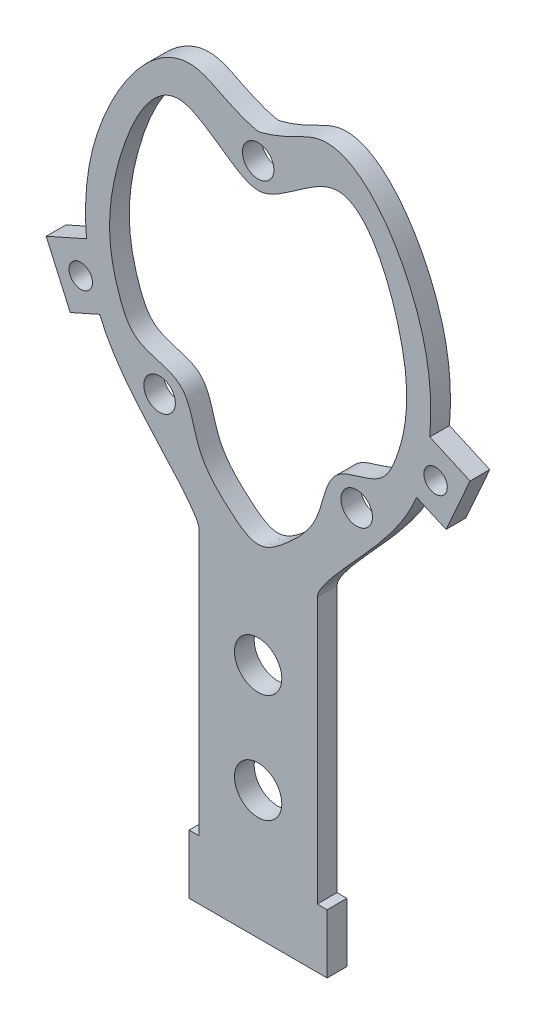
ISO-10303-21;
HEADER;
FILE_DESCRIPTION(('STEP AP214'),'2;1');
FILE_NAME('part.step','',(''),(''),'','','');
FILE_SCHEMA(('AUTOMOTIVE_DESIGN { 1 0 10303 214 1 1 1 1 }'));
ENDSEC;
DATA;
#1=APPLICATION_CONTEXT('core data for automotive mechanical design processes');
#2=APPLICATION_PROTOCOL_DEFINITION('international standard','automotive_design',2000,#1);
#3=PRODUCT_CONTEXT('',#1,'mechanical');
#4=PRODUCT('Part','Part','',(#3));
#5=PRODUCT_RELATED_PRODUCT_CATEGORY('part','',(#4));
#6=PRODUCT_DEFINITION_FORMATION('','',#4);
#7=PRODUCT_DEFINITION_CONTEXT('part definition',#1,'design');
#8=PRODUCT_DEFINITION('design','',#6,#7);
#9=PRODUCT_DEFINITION_SHAPE('','',#8);
#10=(LENGTH_UNIT() NAMED_UNIT(*) SI_UNIT(.MILLI.,.METRE.));
#11=(NAMED_UNIT(*) PLANE_ANGLE_UNIT() SI_UNIT($,.RADIAN.));
#12=(NAMED_UNIT(*) SI_UNIT($,.STERADIAN.) SOLID_ANGLE_UNIT());
#13=UNCERTAINTY_MEASURE_WITH_UNIT(LENGTH_MEASURE(1.E-05),#10,'distance_accuracy_value','');
#14=(GEOMETRIC_REPRESENTATION_CONTEXT(3) GLOBAL_UNCERTAINTY_ASSIGNED_CONTEXT((#13)) GLOBAL_UNIT_ASSIGNED_CONTEXT((#10,
#11,#12)) REPRESENTATION_CONTEXT('',''));
#15=CARTESIAN_POINT('',(0.,0.,0.));
#16=DIRECTION('',(0.,0.,1.));
#17=DIRECTION('',(1.,0.,0.));
#18=AXIS2_PLACEMENT_3D('',#15,#16,#17);
#19=CARTESIAN_POINT('',(3.,-12.1,1.));
#20=CARTESIAN_POINT('',(3.05810382849844,-11.4358702012722,1.));
#21=CARTESIAN_POINT('',(7.37215641866731,-7.261735624356,1.));
#22=CARTESIAN_POINT('',(8.81630154843033,-3.81963664134236,1.));
#23=CARTESIAN_POINT('',(8.79521131462367,3.08822074814355,1.));
#24=CARTESIAN_POINT('',(4.729906030544,9.50271441729498,1.));
#25=CARTESIAN_POINT('',(1.543138013164,7.28524745478808,1.));
#26=CARTESIAN_POINT('',(0.138381746873036,6.84873014882035,1.));
#27=CARTESIAN_POINT('',(-0.138381746873038,6.84873014882035,1.));
#28=CARTESIAN_POINT('',(-1.54313801316398,7.28524745478807,1.));
#29=CARTESIAN_POINT('',(-4.72990603054404,9.50271441729499,1.));
#30=CARTESIAN_POINT('',(-8.79521131462372,3.0882207481436,1.));
#31=CARTESIAN_POINT('',(-8.8163015484302,-3.81963664134249,1.));
#32=CARTESIAN_POINT('',(-7.37215641866838,-7.26173562435472,1.));
#33=CARTESIAN_POINT('',(-3.05810382849843,-11.4358702012722,1.));
#34=CARTESIAN_POINT('',(-3.,-12.1,1.));
#35=B_SPLINE_CURVE_WITH_KNOTS('',3,(#19,#20,#21,#22,#23,#24,#25,#26,#27,#28,#29,#30,#31,#32,#33,
#34),.UNSPECIFIED.,.F.,.F.,(4,1,1,1,1,1,1,1,1,1,1,1,1,4),(0.110531839016768,0.195870509209985,
0.310871914861414,0.375079995003274,0.502014152037678,0.537662277859493,0.553505555343509,
0.55702628367329,0.572869561157307,0.608517686979122,0.735451844013526,0.799659924155386,
0.914661329806814,1.),.UNSPECIFIED.);
#36=DIRECTION('',(0.,0.,-1.));
#37=VECTOR('',#36,1.);
#38=SURFACE_OF_LINEAR_EXTRUSION('',#35,#37);
#39=DIRECTION('',(0.,0.,-1.));
#40=VECTOR('',#39,1.);
#41=CARTESIAN_POINT('',(8.03882350949442,-5.2140110725418,1.));
#42=LINE('',#41,#40);
#43=CARTESIAN_POINT('',(8.03882351508526,-5.2140110590012,1.));
#44=VERTEX_POINT('',#43);
#45=CARTESIAN_POINT('',(8.03882351508526,-5.2140110590012,0.));
#46=VERTEX_POINT('',#45);
#47=EDGE_CURVE('E59',#44,#46,#42,.T.);
#48=ORIENTED_EDGE('',*,*,#47,.F.);
#49=CARTESIAN_POINT('',(3.,-12.1,1.));
#50=VERTEX_POINT('',#49);
#51=EDGE_CURVE('E158',#50,#44,#35,.T.);
#52=ORIENTED_EDGE('',*,*,#51,.F.);
#53=DIRECTION('',(0.,0.,-1.));
#54=VECTOR('',#53,1.);
#55=CARTESIAN_POINT('',(3.,-12.1,1.));
#56=LINE('',#55,#54);
#57=CARTESIAN_POINT('',(3.,-12.1,0.));
#58=VERTEX_POINT('',#57);
#59=EDGE_CURVE('E600',#50,#58,#56,.T.);
#60=ORIENTED_EDGE('',*,*,#59,.T.);
#61=CARTESIAN_POINT('',(3.,-12.1,0.));
#62=CARTESIAN_POINT('',(3.05810382849844,-11.4358702012722,0.));
#63=CARTESIAN_POINT('',(7.37215641866731,-7.261735624356,0.));
#64=CARTESIAN_POINT('',(8.81630154843033,-3.81963664134236,0.));
#65=CARTESIAN_POINT('',(8.79521131462367,3.08822074814355,0.));
#66=CARTESIAN_POINT('',(4.729906030544,9.50271441729498,0.));
#67=CARTESIAN_POINT('',(1.543138013164,7.28524745478808,0.));
#68=CARTESIAN_POINT('',(0.138381746873036,6.84873014882035,0.));
#69=CARTESIAN_POINT('',(-0.138381746873038,6.84873014882035,0.));
#70=CARTESIAN_POINT('',(-1.54313801316398,7.28524745478807,0.));
#71=CARTESIAN_POINT('',(-4.72990603054404,9.50271441729499,0.));
#72=CARTESIAN_POINT('',(-8.79521131462372,3.0882207481436,0.));
#73=CARTESIAN_POINT('',(-8.8163015484302,-3.81963664134249,0.));
#74=CARTESIAN_POINT('',(-7.37215641866838,-7.26173562435472,0.));
#75=CARTESIAN_POINT('',(-3.05810382849843,-11.4358702012722,0.));
#76=CARTESIAN_POINT('',(-3.,-12.1,0.));
#77=B_SPLINE_CURVE_WITH_KNOTS('',3,(#61,#62,#63,#64,#65,#66,#67,#68,#69,#70,#71,#72,#73,#74,#75,
#76),.UNSPECIFIED.,.F.,.F.,(4,1,1,1,1,1,1,1,1,1,1,1,1,4),(0.110531839016768,0.195870509209985,
0.310871914861414,0.375079995003274,0.502014152037678,0.537662277859493,0.553505555343509,
0.55702628367329,0.572869561157307,0.608517686979122,0.735451844013526,0.799659924155386,
0.914661329806814,1.),.UNSPECIFIED.);
#78=EDGE_CURVE('E601',#58,#46,#77,.T.);
#79=ORIENTED_EDGE('',*,*,#78,.T.);
#80=EDGE_LOOP('',(#48,#52,#60,#79));
#81=FACE_BOUND('',#80,.T.);
#82=ADVANCED_FACE('F35',(#81),#38,.F.);
#83=CARTESIAN_POINT('',(8.70653859742456,-2.22738816520244,1.));
#84=VERTEX_POINT('',#83);
#85=CARTESIAN_POINT('',(-8.70653859742455,-2.22738816520243,1.));
#86=VERTEX_POINT('',#85);
#87=EDGE_CURVE('E51',#84,#86,#35,.T.);
#88=ORIENTED_EDGE('',*,*,#87,.F.);
#89=DIRECTION('',(0.,0.,-1.));
#90=VECTOR('',#89,1.);
#91=CARTESIAN_POINT('',(8.70653859884647,-2.22738814841654,1.));
#92=LINE('',#91,#90);
#93=CARTESIAN_POINT('',(8.70653860389698,-2.22738815066517,0.));
#94=VERTEX_POINT('',#93);
#95=EDGE_CURVE('E186',#84,#94,#92,.T.);
#96=ORIENTED_EDGE('',*,*,#95,.T.);
#97=CARTESIAN_POINT('',(-8.70653859742455,-2.22738816520243,0.));
#98=VERTEX_POINT('',#97);
#99=EDGE_CURVE('E565',#94,#98,#77,.T.);
#100=ORIENTED_EDGE('',*,*,#99,.T.);
#101=DIRECTION('',(0.,0.,-1.));
#102=VECTOR('',#101,1.);
#103=CARTESIAN_POINT('',(-8.70653859884646,-2.22738814841654,1.));
#104=LINE('',#103,#102);
#105=EDGE_CURVE('E44',#86,#98,#104,.T.);
#106=ORIENTED_EDGE('',*,*,#105,.F.);
#107=EDGE_LOOP('',(#88,#96,#100,#106));
#108=FACE_BOUND('',#107,.T.);
#109=ADVANCED_FACE('F263',(#108),#38,.F.);
#110=CARTESIAN_POINT('',(4.5364712962688E-13,6.85,1.));
#111=DIRECTION('',(0.,0.,1.));
#112=DIRECTION('',(1.,0.,0.));
#113=AXIS2_PLACEMENT_3D('',#110,#111,#112);
#114=PLANE('',#113);
#115=CARTESIAN_POINT('',(-8.99999999638667,-4.00000000811566,0.999999999999999));
#116=DIRECTION('',(0.,0.,1.));
#117=DIRECTION('',(1.,0.,0.));
#118=AXIS2_PLACEMENT_3D('',#115,#116,#117);
#119=CIRCLE('',#118,0.59499999891735);
#120=CARTESIAN_POINT('',(-8.40499999746932,-4.00000000811566,0.999999999999999));
#121=VERTEX_POINT('',#120);
#122=EDGE_CURVE('E181',#121,#121,#119,.F.);
#123=ORIENTED_EDGE('',*,*,#122,.T.);
#124=EDGE_LOOP('',(#123));
#125=FACE_BOUND('',#124,.T.);
#126=CARTESIAN_POINT('',(8.99999999638667,-4.00000000811566,0.999999999999999));
#127=DIRECTION('',(0.,0.,1.));
#128=DIRECTION('',(1.,0.,0.));
#129=AXIS2_PLACEMENT_3D('',#126,#127,#128);
#130=CIRCLE('',#129,0.594999998917349);
#131=CARTESIAN_POINT('',(9.59499999530402,-4.00000000811566,0.999999999999999));
#132=VERTEX_POINT('',#131);
#133=EDGE_CURVE('E552',#132,#132,#130,.F.);
#134=ORIENTED_EDGE('',*,*,#133,.T.);
#135=EDGE_LOOP('',(#134));
#136=FACE_BOUND('',#135,.T.);
#137=ORIENTED_EDGE('',*,*,#51,.T.);
#138=DIRECTION('',(0.9135454576426,-0.406736643075802,0.));
#139=VECTOR('',#138,1.);
#140=CARTESIAN_POINT('',(-0.607482344183345,-1.36442768453332,1.));
#141=LINE('',#140,#139);
#142=CARTESIAN_POINT('',(9.53182685743955,-5.87873899030865,1.));
#143=VERTEX_POINT('',#142);
#144=EDGE_CURVE('E151',#44,#143,#141,.T.);
#145=ORIENTED_EDGE('',*,*,#144,.T.);
#146=DIRECTION('',(-0.406736643075801,-0.913545457642601,0.));
#147=VECTOR('',#146,1.);
#148=CARTESIAN_POINT('',(10.1393092016229,-4.51431130577532,1.));
#149=LINE('',#148,#147);
#150=CARTESIAN_POINT('',(10.752036786667,-3.13810261738085,1.));
#151=VERTEX_POINT('',#150);
#152=EDGE_CURVE('E157',#151,#143,#149,.T.);
#153=ORIENTED_EDGE('',*,*,#152,.F.);
#154=DIRECTION('',(0.913545457642601,-0.406736643075801,0.));
#155=VECTOR('',#154,1.);
#156=CARTESIAN_POINT('',(0.612727585044053,1.37620868839447,1.));
#157=LINE('',#156,#155);
#158=EDGE_CURVE('E160',#84,#151,#157,.T.);
#159=ORIENTED_EDGE('',*,*,#158,.F.);
#160=ORIENTED_EDGE('',*,*,#87,.T.);
#161=DIRECTION('',(-0.913545457642601,-0.406736643075801,0.));
#162=VECTOR('',#161,1.);
#163=CARTESIAN_POINT('',(-0.612727585044054,1.37620868839447,1.));
#164=LINE('',#163,#162);
#165=CARTESIAN_POINT('',(-10.752036786667,-3.13810261738085,1.));
#166=VERTEX_POINT('',#165);
#167=EDGE_CURVE('E191',#86,#166,#164,.T.);
#168=ORIENTED_EDGE('',*,*,#167,.T.);
#169=DIRECTION('',(0.406736643075801,-0.913545457642601,0.));
#170=VECTOR('',#169,1.);
#171=CARTESIAN_POINT('',(-10.1393092016229,-4.51431130577532,1.));
#172=LINE('',#171,#170);
#173=CARTESIAN_POINT('',(-9.53182685743955,-5.87873899030865,1.));
#174=VERTEX_POINT('',#173);
#175=EDGE_CURVE('E194',#166,#174,#172,.T.);
#176=ORIENTED_EDGE('',*,*,#175,.T.);
#177=DIRECTION('',(-0.9135454576426,-0.406736643075802,0.));
#178=VECTOR('',#177,1.);
#179=CARTESIAN_POINT('',(0.607482344183347,-1.36442768453333,1.));
#180=LINE('',#179,#178);
#181=CARTESIAN_POINT('',(-8.03882351508522,-5.21401105900165,1.));
#182=VERTEX_POINT('',#181);
#183=EDGE_CURVE('E189',#182,#174,#180,.T.);
#184=ORIENTED_EDGE('',*,*,#183,.F.);
#185=CARTESIAN_POINT('',(-3.,-12.1,1.));
#186=VERTEX_POINT('',#185);
#187=EDGE_CURVE('E563',#182,#186,#35,.T.);
#188=ORIENTED_EDGE('',*,*,#187,.T.);
#189=DIRECTION('',(0.,-1.,0.));
#190=VECTOR('',#189,1.);
#191=CARTESIAN_POINT('',(-3.,-12.1,1.));
#192=LINE('',#191,#190);
#193=CARTESIAN_POINT('',(-3.,-25.6,1.));
#194=VERTEX_POINT('',#193);
#195=EDGE_CURVE('E585',#186,#194,#192,.T.);
#196=ORIENTED_EDGE('',*,*,#195,.T.);
#197=DIRECTION('',(-1.,0.,0.));
#198=VECTOR('',#197,1.);
#199=CARTESIAN_POINT('',(-3.,-25.6,1.));
#200=LINE('',#199,#198);
#201=CARTESIAN_POINT('',(-3.50000000000003,-25.6,1.));
#202=VERTEX_POINT('',#201);
#203=EDGE_CURVE('E586',#194,#202,#200,.T.);
#204=ORIENTED_EDGE('',*,*,#203,.T.);
#205=DIRECTION('',(0.,-1.,0.));
#206=VECTOR('',#205,1.);
#207=CARTESIAN_POINT('',(-3.50000000000003,-25.6,1.));
#208=LINE('',#207,#206);
#209=CARTESIAN_POINT('',(-3.49999999999999,-28.6,1.));
#210=VERTEX_POINT('',#209);
#211=EDGE_CURVE('E588',#202,#210,#208,.T.);
#212=ORIENTED_EDGE('',*,*,#211,.T.);
#213=DIRECTION('',(1.,0.,0.));
#214=VECTOR('',#213,1.);
#215=CARTESIAN_POINT('',(-3.49999999999999,-28.6,1.));
#216=LINE('',#215,#214);
#217=CARTESIAN_POINT('',(3.50000000000001,-28.6,1.));
#218=VERTEX_POINT('',#217);
#219=EDGE_CURVE('E592',#210,#218,#216,.T.);
#220=ORIENTED_EDGE('',*,*,#219,.T.);
#221=DIRECTION('',(0.,1.,0.));
#222=VECTOR('',#221,1.);
#223=CARTESIAN_POINT('',(3.50000000000001,-25.6,1.));
#224=LINE('',#223,#222);
#225=CARTESIAN_POINT('',(3.50000000000001,-25.6,1.));
#226=VERTEX_POINT('',#225);
#227=EDGE_CURVE('E594',#218,#226,#224,.T.);
#228=ORIENTED_EDGE('',*,*,#227,.T.);
#229=DIRECTION('',(-1.,0.,0.));
#230=VECTOR('',#229,1.);
#231=CARTESIAN_POINT('',(3.50000000000001,-25.6,1.));
#232=LINE('',#231,#230);
#233=CARTESIAN_POINT('',(3.,-25.6,1.));
#234=VERTEX_POINT('',#233);
#235=EDGE_CURVE('E596',#226,#234,#232,.T.);
#236=ORIENTED_EDGE('',*,*,#235,.T.);
#237=DIRECTION('',(0.,1.,0.));
#238=VECTOR('',#237,1.);
#239=CARTESIAN_POINT('',(3.,-12.1,1.));
#240=LINE('',#239,#238);
#241=EDGE_CURVE('E598',#234,#50,#240,.T.);
#242=ORIENTED_EDGE('',*,*,#241,.T.);
#243=EDGE_LOOP('',(#137,#145,#153,#159,#160,#168,#176,#184,#188,#196,#204,#212,#220,#228,#236,#242));
#244=FACE_BOUND('',#243,.T.);
#245=CARTESIAN_POINT('',(0.,-16.6,1.));
#246=DIRECTION('',(0.,0.,1.));
#247=DIRECTION('',(1.,0.,0.));
#248=AXIS2_PLACEMENT_3D('',#245,#246,#247);
#249=CIRCLE('',#248,1.2);
#250=CARTESIAN_POINT('',(1.2,-16.6,1.));
#251=VERTEX_POINT('',#250);
#252=EDGE_CURVE('E215',#251,#251,#249,.T.);
#253=ORIENTED_EDGE('',*,*,#252,.F.);
#254=EDGE_LOOP('',(#253));
#255=FACE_BOUND('',#254,.T.);
#256=CARTESIAN_POINT('',(-5.,-7.2,1.));
#257=DIRECTION('',(0.,0.,1.));
#258=DIRECTION('',(1.,0.,0.));
#259=AXIS2_PLACEMENT_3D('',#256,#257,#258);
#260=CIRCLE('',#259,0.8);
#261=CARTESIAN_POINT('',(-4.2,-7.2,1.));
#262=VERTEX_POINT('',#261);
#263=EDGE_CURVE('E227',#262,#262,#260,.T.);
#264=ORIENTED_EDGE('',*,*,#263,.F.);
#265=EDGE_LOOP('',(#264));
#266=FACE_BOUND('',#265,.T.);
#267=CARTESIAN_POINT('',(0.,4.25,1.));
#268=CARTESIAN_POINT('',(-0.417612959241417,4.25,1.));
#269=CARTESIAN_POINT('',(-1.80690934296593,5.01629001903987,1.));
#270=CARTESIAN_POINT('',(-4.90120456094953,7.75406004665749,1.));
#271=CARTESIAN_POINT('',(-7.77102892828171,1.12814854184186,1.));
#272=CARTESIAN_POINT('',(-7.63128250838788,-2.66139211837862,1.));
#273=CARTESIAN_POINT('',(-6.25678998999508,-5.75795043264524,1.));
#274=CARTESIAN_POINT('',(-3.50148126295744,-5.76089978012249,1.));
#275=CARTESIAN_POINT('',(-3.23010948222929,-8.78442848255788,1.));
#276=CARTESIAN_POINT('',(-1.74530404014567,-10.3140203641093,1.));
#277=CARTESIAN_POINT('',(0.,-11.6773888370486,1.));
#278=CARTESIAN_POINT('',(1.74530404014568,-10.3140203641093,1.));
#279=CARTESIAN_POINT('',(3.23010948222929,-8.78442848255788,1.));
#280=CARTESIAN_POINT('',(3.50148126295744,-5.76089978012249,1.));
#281=CARTESIAN_POINT('',(6.25678998999508,-5.75795043264524,1.));
#282=CARTESIAN_POINT('',(7.63128250838788,-2.66139211837861,1.));
#283=CARTESIAN_POINT('',(7.77102892828171,1.12814854184186,1.));
#284=CARTESIAN_POINT('',(4.90120456094953,7.75406004665749,1.));
#285=CARTESIAN_POINT('',(1.80690934296593,5.01629001903987,1.));
#286=CARTESIAN_POINT('',(0.417612959241417,4.25,1.));
#287=CARTESIAN_POINT('',(0.,4.25,1.));
#288=B_SPLINE_CURVE_WITH_KNOTS('',3,(#267,#268,#269,#270,#271,#272,#273,#274,#275,#276,#277,
#278,#279,#280,#281,#282,#283,#284,#285,#286,#287),.UNSPECIFIED.,.T.,.F.,(4,1,1,1,1,1,1,1,1,1,1,
1,1,1,1,1,1,1,4),(0.,0.0256073609969135,0.0851894397491001,0.194127412314609,0.29881024186166,
0.326537395156787,0.373370364280356,0.421073962555122,0.469790648406979,0.5,0.530209351593021,
0.578926037444877,0.626629635719644,0.673462604843213,0.70118975813834,0.805872587685391,
0.9148105602509,0.974392639003086,1.),.UNSPECIFIED.);
#289=CARTESIAN_POINT('',(0.,4.25,1.));
#290=VERTEX_POINT('',#289);
#291=EDGE_CURVE('E239',#290,#290,#288,.T.);
#292=ORIENTED_EDGE('',*,*,#291,.F.);
#293=EDGE_LOOP('',(#292));
#294=FACE_BOUND('',#293,.T.);
#295=CARTESIAN_POINT('',(0.,5.55,1.));
#296=DIRECTION('',(0.,0.,1.));
#297=DIRECTION('',(1.,0.,0.));
#298=AXIS2_PLACEMENT_3D('',#295,#296,#297);
#299=CIRCLE('',#298,0.8);
#300=CARTESIAN_POINT('',(0.8,5.55,1.));
#301=VERTEX_POINT('',#300);
#302=EDGE_CURVE('E233',#301,#301,#299,.T.);
#303=ORIENTED_EDGE('',*,*,#302,.F.);
#304=EDGE_LOOP('',(#303));
#305=FACE_BOUND('',#304,.T.);
#306=CARTESIAN_POINT('',(5.,-7.2,1.));
#307=DIRECTION('',(0.,0.,1.));
#308=DIRECTION('',(-1.,0.,0.));
#309=AXIS2_PLACEMENT_3D('',#306,#307,#308);
#310=CIRCLE('',#309,0.8);
#311=CARTESIAN_POINT('',(4.2,-7.2,1.));
#312=VERTEX_POINT('',#311);
#313=EDGE_CURVE('E221',#312,#312,#310,.T.);
#314=ORIENTED_EDGE('',*,*,#313,.F.);
#315=EDGE_LOOP('',(#314));
#316=FACE_BOUND('',#315,.T.);
#317=CARTESIAN_POINT('',(0.,-22.1,1.));
#318=DIRECTION('',(0.,0.,1.));
#319=DIRECTION('',(1.,0.,0.));
#320=AXIS2_PLACEMENT_3D('',#317,#318,#319);
#321=CIRCLE('',#320,1.2);
#322=CARTESIAN_POINT('',(1.2,-22.1,1.));
#323=VERTEX_POINT('',#322);
#324=EDGE_CURVE('E209',#323,#323,#321,.T.);
#325=ORIENTED_EDGE('',*,*,#324,.F.);
#326=EDGE_LOOP('',(#325));
#327=FACE_BOUND('',#326,.T.);
#328=ADVANCED_FACE('F153',(#125,#136,#244,#255,#266,#294,#305,#316,#327),#114,.T.);
#329=CARTESIAN_POINT('',(4.5364712962688E-13,6.85,0.));
#330=DIRECTION('',(0.,0.,1.));
#331=DIRECTION('',(1.,0.,0.));
#332=AXIS2_PLACEMENT_3D('',#329,#330,#331);
#333=PLANE('',#332);
#334=CARTESIAN_POINT('',(-8.99999999638667,-4.00000000811566,0.));
#335=DIRECTION('',(0.,0.,1.));
#336=DIRECTION('',(1.,0.,0.));
#337=AXIS2_PLACEMENT_3D('',#334,#335,#336);
#338=CIRCLE('',#337,0.59499999891735);
#339=CARTESIAN_POINT('',(-8.40499999746932,-4.00000000811566,0.));
#340=VERTEX_POINT('',#339);
#341=EDGE_CURVE('E551',#340,#340,#338,.T.);
#342=ORIENTED_EDGE('',*,*,#341,.T.);
#343=EDGE_LOOP('',(#342));
#344=FACE_BOUND('',#343,.T.);
#345=CARTESIAN_POINT('',(8.99999999638667,-4.00000000811566,0.));
#346=DIRECTION('',(0.,0.,1.));
#347=DIRECTION('',(-1.,0.,0.));
#348=AXIS2_PLACEMENT_3D('',#345,#346,#347);
#349=CIRCLE('',#348,0.594999998917349);
#350=CARTESIAN_POINT('',(8.40499999746932,-4.00000000811566,0.));
#351=VERTEX_POINT('',#350);
#352=EDGE_CURVE('E553',#351,#351,#349,.T.);
#353=ORIENTED_EDGE('',*,*,#352,.T.);
#354=EDGE_LOOP('',(#353));
#355=FACE_BOUND('',#354,.T.);
#356=ORIENTED_EDGE('',*,*,#99,.F.);
#357=DIRECTION('',(0.913545457642601,-0.406736643075801,0.));
#358=VECTOR('',#357,1.);
#359=CARTESIAN_POINT('',(0.612727585044053,1.37620868839447,0.));
#360=LINE('',#359,#358);
#361=CARTESIAN_POINT('',(10.752036786667,-3.13810261738085,0.));
#362=VERTEX_POINT('',#361);
#363=EDGE_CURVE('E179',#94,#362,#360,.T.);
#364=ORIENTED_EDGE('',*,*,#363,.T.);
#365=DIRECTION('',(-0.406736643075801,-0.913545457642601,0.));
#366=VECTOR('',#365,1.);
#367=CARTESIAN_POINT('',(10.1393092016229,-4.51431130577532,0.));
#368=LINE('',#367,#366);
#369=CARTESIAN_POINT('',(9.53182685743955,-5.87873899030865,0.));
#370=VERTEX_POINT('',#369);
#371=EDGE_CURVE('E183',#362,#370,#368,.T.);
#372=ORIENTED_EDGE('',*,*,#371,.T.);
#373=DIRECTION('',(0.9135454576426,-0.406736643075802,0.));
#374=VECTOR('',#373,1.);
#375=CARTESIAN_POINT('',(-0.607482344183345,-1.36442768453332,0.));
#376=LINE('',#375,#374);
#377=EDGE_CURVE('E166',#46,#370,#376,.T.);
#378=ORIENTED_EDGE('',*,*,#377,.F.);
#379=ORIENTED_EDGE('',*,*,#78,.F.);
#380=DIRECTION('',(0.,1.,0.));
#381=VECTOR('',#380,1.);
#382=CARTESIAN_POINT('',(3.,-12.1,0.));
#383=LINE('',#382,#381);
#384=CARTESIAN_POINT('',(3.,-25.6,0.));
#385=VERTEX_POINT('',#384);
#386=EDGE_CURVE('E578',#385,#58,#383,.T.);
#387=ORIENTED_EDGE('',*,*,#386,.F.);
#388=DIRECTION('',(-1.,0.,0.));
#389=VECTOR('',#388,1.);
#390=CARTESIAN_POINT('',(3.50000000000001,-25.6,0.));
#391=LINE('',#390,#389);
#392=CARTESIAN_POINT('',(3.50000000000001,-25.6,0.));
#393=VERTEX_POINT('',#392);
#394=EDGE_CURVE('E579',#393,#385,#391,.T.);
#395=ORIENTED_EDGE('',*,*,#394,.F.);
#396=DIRECTION('',(0.,1.,0.));
#397=VECTOR('',#396,1.);
#398=CARTESIAN_POINT('',(3.50000000000001,-25.6,0.));
#399=LINE('',#398,#397);
#400=CARTESIAN_POINT('',(3.50000000000001,-28.6,0.));
#401=VERTEX_POINT('',#400);
#402=EDGE_CURVE('E616',#401,#393,#399,.T.);
#403=ORIENTED_EDGE('',*,*,#402,.F.);
#404=DIRECTION('',(1.,0.,0.));
#405=VECTOR('',#404,1.);
#406=CARTESIAN_POINT('',(-3.49999999999999,-28.6,0.));
#407=LINE('',#406,#405);
#408=CARTESIAN_POINT('',(-3.49999999999999,-28.6,0.));
#409=VERTEX_POINT('',#408);
#410=EDGE_CURVE('E614',#409,#401,#407,.T.);
#411=ORIENTED_EDGE('',*,*,#410,.F.);
#412=DIRECTION('',(0.,-1.,0.));
#413=VECTOR('',#412,1.);
#414=CARTESIAN_POINT('',(-3.50000000000003,-25.6,0.));
#415=LINE('',#414,#413);
#416=CARTESIAN_POINT('',(-3.50000000000003,-25.6,0.));
#417=VERTEX_POINT('',#416);
#418=EDGE_CURVE('E612',#417,#409,#415,.T.);
#419=ORIENTED_EDGE('',*,*,#418,.F.);
#420=DIRECTION('',(-1.,0.,0.));
#421=VECTOR('',#420,1.);
#422=CARTESIAN_POINT('',(-3.,-25.6,0.));
#423=LINE('',#422,#421);
#424=CARTESIAN_POINT('',(-3.,-25.6,0.));
#425=VERTEX_POINT('',#424);
#426=EDGE_CURVE('E610',#425,#417,#423,.T.);
#427=ORIENTED_EDGE('',*,*,#426,.F.);
#428=DIRECTION('',(0.,-1.,0.));
#429=VECTOR('',#428,1.);
#430=CARTESIAN_POINT('',(-3.,-12.1,0.));
#431=LINE('',#430,#429);
#432=CARTESIAN_POINT('',(-3.,-12.1,0.));
#433=VERTEX_POINT('',#432);
#434=EDGE_CURVE('E605',#433,#425,#431,.T.);
#435=ORIENTED_EDGE('',*,*,#434,.F.);
#436=CARTESIAN_POINT('',(-8.03882350912916,-5.21401107237918,0.));
#437=VERTEX_POINT('',#436);
#438=EDGE_CURVE('E245',#437,#433,#77,.T.);
#439=ORIENTED_EDGE('',*,*,#438,.F.);
#440=DIRECTION('',(-0.9135454576426,-0.406736643075802,0.));
#441=VECTOR('',#440,1.);
#442=CARTESIAN_POINT('',(0.607482344183347,-1.36442768453333,0.));
#443=LINE('',#442,#441);
#444=CARTESIAN_POINT('',(-9.53182685743955,-5.87873899030865,0.));
#445=VERTEX_POINT('',#444);
#446=EDGE_CURVE('E188',#437,#445,#443,.T.);
#447=ORIENTED_EDGE('',*,*,#446,.T.);
#448=DIRECTION('',(0.406736643075801,-0.913545457642601,0.));
#449=VECTOR('',#448,1.);
#450=CARTESIAN_POINT('',(-10.1393092016229,-4.51431130577532,0.));
#451=LINE('',#450,#449);
#452=CARTESIAN_POINT('',(-10.752036786667,-3.13810261738085,0.));
#453=VERTEX_POINT('',#452);
#454=EDGE_CURVE('E192',#453,#445,#451,.T.);
#455=ORIENTED_EDGE('',*,*,#454,.F.);
#456=DIRECTION('',(-0.913545457642601,-0.406736643075801,0.));
#457=VECTOR('',#456,1.);
#458=CARTESIAN_POINT('',(-0.612727585044054,1.37620868839447,0.));
#459=LINE('',#458,#457);
#460=EDGE_CURVE('E199',#98,#453,#459,.T.);
#461=ORIENTED_EDGE('',*,*,#460,.F.);
#462=EDGE_LOOP('',(#356,#364,#372,#378,#379,#387,#395,#403,#411,#419,#427,#435,#439,#447,#455,#461));
#463=FACE_BOUND('',#462,.T.);
#464=CARTESIAN_POINT('',(0.,4.25,0.));
#465=CARTESIAN_POINT('',(-0.417612959241417,4.25,0.));
#466=CARTESIAN_POINT('',(-1.80690934296593,5.01629001903987,0.));
#467=CARTESIAN_POINT('',(-4.90120456094953,7.75406004665749,0.));
#468=CARTESIAN_POINT('',(-7.77102892828171,1.12814854184186,0.));
#469=CARTESIAN_POINT('',(-7.63128250838788,-2.66139211837862,0.));
#470=CARTESIAN_POINT('',(-6.25678998999508,-5.75795043264524,0.));
#471=CARTESIAN_POINT('',(-3.50148126295744,-5.76089978012249,0.));
#472=CARTESIAN_POINT('',(-3.23010948222929,-8.78442848255788,0.));
#473=CARTESIAN_POINT('',(-1.74530404014567,-10.3140203641093,0.));
#474=CARTESIAN_POINT('',(0.,-11.6773888370486,0.));
#475=CARTESIAN_POINT('',(1.74530404014568,-10.3140203641093,0.));
#476=CARTESIAN_POINT('',(3.23010948222929,-8.78442848255788,0.));
#477=CARTESIAN_POINT('',(3.50148126295744,-5.76089978012249,0.));
#478=CARTESIAN_POINT('',(6.25678998999508,-5.75795043264524,0.));
#479=CARTESIAN_POINT('',(7.63128250838788,-2.66139211837861,0.));
#480=CARTESIAN_POINT('',(7.77102892828171,1.12814854184186,0.));
#481=CARTESIAN_POINT('',(4.90120456094953,7.75406004665749,0.));
#482=CARTESIAN_POINT('',(1.80690934296593,5.01629001903987,0.));
#483=CARTESIAN_POINT('',(0.417612959241417,4.25,0.));
#484=CARTESIAN_POINT('',(0.,4.25,0.));
#485=B_SPLINE_CURVE_WITH_KNOTS('',3,(#464,#465,#466,#467,#468,#469,#470,#471,#472,#473,#474,
#475,#476,#477,#478,#479,#480,#481,#482,#483,#484),.UNSPECIFIED.,.T.,.F.,(4,1,1,1,1,1,1,1,1,1,1,
1,1,1,1,1,1,1,4),(0.,0.0256073609969135,0.0851894397491001,0.194127412314609,0.29881024186166,
0.326537395156787,0.373370364280356,0.421073962555122,0.469790648406979,0.5,0.530209351593021,
0.578926037444877,0.626629635719644,0.673462604843213,0.70118975813834,0.805872587685391,
0.9148105602509,0.974392639003086,1.),.UNSPECIFIED.);
#486=CARTESIAN_POINT('',(0.,4.25,0.));
#487=VERTEX_POINT('',#486);
#488=EDGE_CURVE('E236',#487,#487,#485,.T.);
#489=ORIENTED_EDGE('',*,*,#488,.T.);
#490=EDGE_LOOP('',(#489));
#491=FACE_BOUND('',#490,.T.);
#492=CARTESIAN_POINT('',(0.,5.55,0.));
#493=DIRECTION('',(0.,0.,1.));
#494=DIRECTION('',(1.,0.,0.));
#495=AXIS2_PLACEMENT_3D('',#492,#493,#494);
#496=CIRCLE('',#495,0.8);
#497=CARTESIAN_POINT('',(0.8,5.55,0.));
#498=VERTEX_POINT('',#497);
#499=EDGE_CURVE('E230',#498,#498,#496,.T.);
#500=ORIENTED_EDGE('',*,*,#499,.T.);
#501=EDGE_LOOP('',(#500));
#502=FACE_BOUND('',#501,.T.);
#503=CARTESIAN_POINT('',(-5.,-7.2,0.));
#504=DIRECTION('',(0.,0.,1.));
#505=DIRECTION('',(1.,0.,0.));
#506=AXIS2_PLACEMENT_3D('',#503,#504,#505);
#507=CIRCLE('',#506,0.8);
#508=CARTESIAN_POINT('',(-4.2,-7.2,0.));
#509=VERTEX_POINT('',#508);
#510=EDGE_CURVE('E224',#509,#509,#507,.T.);
#511=ORIENTED_EDGE('',*,*,#510,.T.);
#512=EDGE_LOOP('',(#511));
#513=FACE_BOUND('',#512,.T.);
#514=CARTESIAN_POINT('',(5.,-7.2,0.));
#515=DIRECTION('',(0.,0.,1.));
#516=DIRECTION('',(-1.,0.,0.));
#517=AXIS2_PLACEMENT_3D('',#514,#515,#516);
#518=CIRCLE('',#517,0.8);
#519=CARTESIAN_POINT('',(4.2,-7.2,0.));
#520=VERTEX_POINT('',#519);
#521=EDGE_CURVE('E218',#520,#520,#518,.T.);
#522=ORIENTED_EDGE('',*,*,#521,.T.);
#523=EDGE_LOOP('',(#522));
#524=FACE_BOUND('',#523,.T.);
#525=CARTESIAN_POINT('',(0.,-16.6,0.));
#526=DIRECTION('',(0.,0.,1.));
#527=DIRECTION('',(1.,0.,0.));
#528=AXIS2_PLACEMENT_3D('',#525,#526,#527);
#529=CIRCLE('',#528,1.2);
#530=CARTESIAN_POINT('',(1.2,-16.6,0.));
#531=VERTEX_POINT('',#530);
#532=EDGE_CURVE('E212',#531,#531,#529,.T.);
#533=ORIENTED_EDGE('',*,*,#532,.T.);
#534=EDGE_LOOP('',(#533));
#535=FACE_BOUND('',#534,.T.);
#536=CARTESIAN_POINT('',(0.,-22.1,0.));
#537=DIRECTION('',(0.,0.,1.));
#538=DIRECTION('',(1.,0.,0.));
#539=AXIS2_PLACEMENT_3D('',#536,#537,#538);
#540=CIRCLE('',#539,1.2);
#541=CARTESIAN_POINT('',(1.2,-22.1,0.));
#542=VERTEX_POINT('',#541);
#543=EDGE_CURVE('E208',#542,#542,#540,.T.);
#544=ORIENTED_EDGE('',*,*,#543,.T.);
#545=EDGE_LOOP('',(#544));
#546=FACE_BOUND('',#545,.T.);
#547=ADVANCED_FACE('F262',(#344,#355,#463,#491,#502,#513,#524,#535,#546),#333,.F.);
#548=ORIENTED_EDGE('',*,*,#187,.F.);
#549=DIRECTION('',(0.,0.,-1.));
#550=VECTOR('',#549,1.);
#551=CARTESIAN_POINT('',(-8.03882350949455,-5.21401107254185,1.));
#552=LINE('',#551,#550);
#553=EDGE_CURVE('E11',#182,#437,#552,.T.);
#554=ORIENTED_EDGE('',*,*,#553,.T.);
#555=ORIENTED_EDGE('',*,*,#438,.T.);
#556=DIRECTION('',(0.,0.,-1.));
#557=VECTOR('',#556,1.);
#558=CARTESIAN_POINT('',(-3.,-12.1,1.));
#559=LINE('',#558,#557);
#560=EDGE_CURVE('E567',#186,#433,#559,.T.);
#561=ORIENTED_EDGE('',*,*,#560,.F.);
#562=EDGE_LOOP('',(#548,#554,#555,#561));
#563=FACE_BOUND('',#562,.T.);
#564=ADVANCED_FACE('F37',(#563),#38,.F.);
#565=CARTESIAN_POINT('',(-3.,-12.1,1.));
#566=DIRECTION('',(1.,0.,0.));
#567=DIRECTION('',(0.,1.,0.));
#568=AXIS2_PLACEMENT_3D('',#565,#566,#567);
#569=PLANE('',#568);
#570=ORIENTED_EDGE('',*,*,#434,.T.);
#571=DIRECTION('',(0.,0.,-1.));
#572=VECTOR('',#571,1.);
#573=CARTESIAN_POINT('',(-3.,-25.6,1.));
#574=LINE('',#573,#572);
#575=EDGE_CURVE('E636',#194,#425,#574,.T.);
#576=ORIENTED_EDGE('',*,*,#575,.F.);
#577=ORIENTED_EDGE('',*,*,#195,.F.);
#578=ORIENTED_EDGE('',*,*,#560,.T.);
#579=EDGE_LOOP('',(#570,#576,#577,#578));
#580=FACE_BOUND('',#579,.T.);
#581=ADVANCED_FACE('F289',(#580),#569,.F.);
#582=CARTESIAN_POINT('',(-3.,-25.6,1.));
#583=DIRECTION('',(0.,-1.,0.));
#584=DIRECTION('',(0.,0.,-1.));
#585=AXIS2_PLACEMENT_3D('',#582,#583,#584);
#586=PLANE('',#585);
#587=ORIENTED_EDGE('',*,*,#426,.T.);
#588=DIRECTION('',(0.,0.,-1.));
#589=VECTOR('',#588,1.);
#590=CARTESIAN_POINT('',(-3.50000000000003,-25.6,1.));
#591=LINE('',#590,#589);
#592=EDGE_CURVE('E633',#202,#417,#591,.T.);
#593=ORIENTED_EDGE('',*,*,#592,.F.);
#594=ORIENTED_EDGE('',*,*,#203,.F.);
#595=ORIENTED_EDGE('',*,*,#575,.T.);
#596=EDGE_LOOP('',(#587,#593,#594,#595));
#597=FACE_BOUND('',#596,.T.);
#598=ADVANCED_FACE('F286',(#597),#586,.F.);
#599=CARTESIAN_POINT('',(-3.50000000000003,-25.6,1.));
#600=DIRECTION('',(1.,0.,0.));
#601=DIRECTION('',(0.,1.,0.));
#602=AXIS2_PLACEMENT_3D('',#599,#600,#601);
#603=PLANE('',#602);
#604=ORIENTED_EDGE('',*,*,#418,.T.);
#605=DIRECTION('',(0.,0.,-1.));
#606=VECTOR('',#605,1.);
#607=CARTESIAN_POINT('',(-3.49999999999999,-28.6,1.));
#608=LINE('',#607,#606);
#609=EDGE_CURVE('E630',#210,#409,#608,.T.);
#610=ORIENTED_EDGE('',*,*,#609,.F.);
#611=ORIENTED_EDGE('',*,*,#211,.F.);
#612=ORIENTED_EDGE('',*,*,#592,.T.);
#613=EDGE_LOOP('',(#604,#610,#611,#612));
#614=FACE_BOUND('',#613,.T.);
#615=ADVANCED_FACE('F282',(#614),#603,.F.);
#616=CARTESIAN_POINT('',(-3.49999999999999,-28.6,1.));
#617=DIRECTION('',(0.,1.,0.));
#618=DIRECTION('',(0.,0.,1.));
#619=AXIS2_PLACEMENT_3D('',#616,#617,#618);
#620=PLANE('',#619);
#621=ORIENTED_EDGE('',*,*,#410,.T.);
#622=DIRECTION('',(0.,0.,-1.));
#623=VECTOR('',#622,1.);
#624=CARTESIAN_POINT('',(3.50000000000001,-28.6,1.));
#625=LINE('',#624,#623);
#626=EDGE_CURVE('E627',#218,#401,#625,.T.);
#627=ORIENTED_EDGE('',*,*,#626,.F.);
#628=ORIENTED_EDGE('',*,*,#219,.F.);
#629=ORIENTED_EDGE('',*,*,#609,.T.);
#630=EDGE_LOOP('',(#621,#627,#628,#629));
#631=FACE_BOUND('',#630,.T.);
#632=ADVANCED_FACE('F278',(#631),#620,.F.);
#633=CARTESIAN_POINT('',(3.50000000000001,-25.6,1.));
#634=DIRECTION('',(-1.,0.,0.));
#635=DIRECTION('',(0.,-1.,0.));
#636=AXIS2_PLACEMENT_3D('',#633,#634,#635);
#637=PLANE('',#636);
#638=ORIENTED_EDGE('',*,*,#402,.T.);
#639=DIRECTION('',(0.,0.,-1.));
#640=VECTOR('',#639,1.);
#641=CARTESIAN_POINT('',(3.50000000000001,-25.6,1.));
#642=LINE('',#641,#640);
#643=EDGE_CURVE('E624',#226,#393,#642,.T.);
#644=ORIENTED_EDGE('',*,*,#643,.F.);
#645=ORIENTED_EDGE('',*,*,#227,.F.);
#646=ORIENTED_EDGE('',*,*,#626,.T.);
#647=EDGE_LOOP('',(#638,#644,#645,#646));
#648=FACE_BOUND('',#647,.T.);
#649=ADVANCED_FACE('F274',(#648),#637,.F.);
#650=CARTESIAN_POINT('',(3.50000000000001,-25.6,1.));
#651=DIRECTION('',(0.,-1.,0.));
#652=DIRECTION('',(0.,0.,-1.));
#653=AXIS2_PLACEMENT_3D('',#650,#651,#652);
#654=PLANE('',#653);
#655=ORIENTED_EDGE('',*,*,#394,.T.);
#656=DIRECTION('',(0.,0.,-1.));
#657=VECTOR('',#656,1.);
#658=CARTESIAN_POINT('',(3.,-25.6,1.));
#659=LINE('',#658,#657);
#660=EDGE_CURVE('E621',#234,#385,#659,.T.);
#661=ORIENTED_EDGE('',*,*,#660,.F.);
#662=ORIENTED_EDGE('',*,*,#235,.F.);
#663=ORIENTED_EDGE('',*,*,#643,.T.);
#664=EDGE_LOOP('',(#655,#661,#662,#663));
#665=FACE_BOUND('',#664,.T.);
#666=ADVANCED_FACE('F270',(#665),#654,.F.);
#667=CARTESIAN_POINT('',(3.,-12.1,1.));
#668=DIRECTION('',(-1.,0.,0.));
#669=DIRECTION('',(0.,-1.,0.));
#670=AXIS2_PLACEMENT_3D('',#667,#668,#669);
#671=PLANE('',#670);
#672=ORIENTED_EDGE('',*,*,#386,.T.);
#673=ORIENTED_EDGE('',*,*,#59,.F.);
#674=ORIENTED_EDGE('',*,*,#241,.F.);
#675=ORIENTED_EDGE('',*,*,#660,.T.);
#676=EDGE_LOOP('',(#672,#673,#674,#675));
#677=FACE_BOUND('',#676,.T.);
#678=ADVANCED_FACE('F257',(#677),#671,.F.);
#679=DIRECTION('',(0.,0.,-1.));
#680=VECTOR('',#679,1.);
#681=SURFACE_OF_LINEAR_EXTRUSION('',#288,#680);
#682=ORIENTED_EDGE('',*,*,#291,.T.);
#683=EDGE_LOOP('',(#682));
#684=FACE_BOUND('',#683,.T.);
#685=ORIENTED_EDGE('',*,*,#488,.F.);
#686=EDGE_LOOP('',(#685));
#687=FACE_BOUND('',#686,.T.);
#688=ADVANCED_FACE('F252',(#684,#687),#681,.T.);
#689=CARTESIAN_POINT('',(0.,5.55,1.));
#690=DIRECTION('',(0.,0.,-1.));
#691=DIRECTION('',(-1.,0.,0.));
#692=AXIS2_PLACEMENT_3D('',#689,#690,#691);
#693=CYLINDRICAL_SURFACE('',#692,0.8);
#694=ORIENTED_EDGE('',*,*,#302,.T.);
#695=EDGE_LOOP('',(#694));
#696=FACE_BOUND('',#695,.T.);
#697=ORIENTED_EDGE('',*,*,#499,.F.);
#698=EDGE_LOOP('',(#697));
#699=FACE_BOUND('',#698,.T.);
#700=ADVANCED_FACE('F256',(#696,#699),#693,.F.);
#701=CARTESIAN_POINT('',(-5.,-7.2,1.));
#702=DIRECTION('',(0.,0.,-1.));
#703=DIRECTION('',(-1.,0.,0.));
#704=AXIS2_PLACEMENT_3D('',#701,#702,#703);
#705=CYLINDRICAL_SURFACE('',#704,0.8);
#706=ORIENTED_EDGE('',*,*,#263,.T.);
#707=EDGE_LOOP('',(#706));
#708=FACE_BOUND('',#707,.T.);
#709=ORIENTED_EDGE('',*,*,#510,.F.);
#710=EDGE_LOOP('',(#709));
#711=FACE_BOUND('',#710,.T.);
#712=ADVANCED_FACE('F414',(#708,#711),#705,.F.);
#713=CARTESIAN_POINT('',(5.,-7.2,1.));
#714=DIRECTION('',(0.,0.,-1.));
#715=DIRECTION('',(-1.,0.,0.));
#716=AXIS2_PLACEMENT_3D('',#713,#714,#715);
#717=CYLINDRICAL_SURFACE('',#716,0.8);
#718=ORIENTED_EDGE('',*,*,#313,.T.);
#719=EDGE_LOOP('',(#718));
#720=FACE_BOUND('',#719,.T.);
#721=ORIENTED_EDGE('',*,*,#521,.F.);
#722=EDGE_LOOP('',(#721));
#723=FACE_BOUND('',#722,.T.);
#724=ADVANCED_FACE('F411',(#720,#723),#717,.F.);
#725=CARTESIAN_POINT('',(0.,-16.6,1.));
#726=DIRECTION('',(0.,0.,-1.));
#727=DIRECTION('',(-1.,0.,0.));
#728=AXIS2_PLACEMENT_3D('',#725,#726,#727);
#729=CYLINDRICAL_SURFACE('',#728,1.2);
#730=ORIENTED_EDGE('',*,*,#252,.T.);
#731=EDGE_LOOP('',(#730));
#732=FACE_BOUND('',#731,.T.);
#733=ORIENTED_EDGE('',*,*,#532,.F.);
#734=EDGE_LOOP('',(#733));
#735=FACE_BOUND('',#734,.T.);
#736=ADVANCED_FACE('F407',(#732,#735),#729,.F.);
#737=CARTESIAN_POINT('',(0.,-22.1,1.));
#738=DIRECTION('',(0.,0.,-1.));
#739=DIRECTION('',(-1.,0.,0.));
#740=AXIS2_PLACEMENT_3D('',#737,#738,#739);
#741=CYLINDRICAL_SURFACE('',#740,1.2);
#742=ORIENTED_EDGE('',*,*,#324,.T.);
#743=EDGE_LOOP('',(#742));
#744=FACE_BOUND('',#743,.T.);
#745=ORIENTED_EDGE('',*,*,#543,.F.);
#746=EDGE_LOOP('',(#745));
#747=FACE_BOUND('',#746,.T.);
#748=ADVANCED_FACE('F330',(#744,#747),#741,.F.);
#749=CARTESIAN_POINT('',(0.607482344183347,-1.36442768453333,1.));
#750=DIRECTION('',(0.406736643075802,-0.9135454576426,0.));
#751=DIRECTION('',(0.9135454576426,0.406736643075802,0.));
#752=AXIS2_PLACEMENT_3D('',#749,#750,#751);
#753=PLANE('',#752);
#754=ORIENTED_EDGE('',*,*,#553,.F.);
#755=ORIENTED_EDGE('',*,*,#183,.T.);
#756=DIRECTION('',(0.,0.,-1.));
#757=VECTOR('',#756,1.);
#758=CARTESIAN_POINT('',(-9.53182685743955,-5.87873899030865,1.));
#759=LINE('',#758,#757);
#760=EDGE_CURVE('E197',#174,#445,#759,.T.);
#761=ORIENTED_EDGE('',*,*,#760,.T.);
#762=ORIENTED_EDGE('',*,*,#446,.F.);
#763=EDGE_LOOP('',(#754,#755,#761,#762));
#764=FACE_BOUND('',#763,.T.);
#765=ADVANCED_FACE('F324',(#764),#753,.T.);
#766=CARTESIAN_POINT('',(-0.612727585044054,1.37620868839447,1.));
#767=DIRECTION('',(0.406736643075801,-0.913545457642601,0.));
#768=DIRECTION('',(0.913545457642601,0.406736643075801,0.));
#769=AXIS2_PLACEMENT_3D('',#766,#767,#768);
#770=PLANE('',#769);
#771=ORIENTED_EDGE('',*,*,#167,.F.);
#772=ORIENTED_EDGE('',*,*,#105,.T.);
#773=ORIENTED_EDGE('',*,*,#460,.T.);
#774=DIRECTION('',(0.,0.,-1.));
#775=VECTOR('',#774,1.);
#776=CARTESIAN_POINT('',(-10.752036786667,-3.13810261738085,1.));
#777=LINE('',#776,#775);
#778=EDGE_CURVE('E205',#166,#453,#777,.T.);
#779=ORIENTED_EDGE('',*,*,#778,.F.);
#780=EDGE_LOOP('',(#771,#772,#773,#779));
#781=FACE_BOUND('',#780,.T.);
#782=ADVANCED_FACE('F329',(#781),#770,.F.);
#783=CARTESIAN_POINT('',(-10.1393092016229,-4.51431130577532,1.));
#784=DIRECTION('',(0.913545457642601,0.406736643075801,0.));
#785=DIRECTION('',(-0.406736643075801,0.913545457642601,0.));
#786=AXIS2_PLACEMENT_3D('',#783,#784,#785);
#787=PLANE('',#786);
#788=ORIENTED_EDGE('',*,*,#454,.T.);
#789=ORIENTED_EDGE('',*,*,#760,.F.);
#790=ORIENTED_EDGE('',*,*,#175,.F.);
#791=ORIENTED_EDGE('',*,*,#778,.T.);
#792=EDGE_LOOP('',(#788,#789,#790,#791));
#793=FACE_BOUND('',#792,.T.);
#794=ADVANCED_FACE('F343',(#793),#787,.F.);
#795=CARTESIAN_POINT('',(0.612727585044053,1.37620868839447,1.));
#796=DIRECTION('',(0.406736643075801,0.913545457642601,0.));
#797=DIRECTION('',(-0.913545457642601,0.406736643075801,0.));
#798=AXIS2_PLACEMENT_3D('',#795,#796,#797);
#799=PLANE('',#798);
#800=ORIENTED_EDGE('',*,*,#95,.F.);
#801=ORIENTED_EDGE('',*,*,#158,.T.);
#802=DIRECTION('',(0.,0.,-1.));
#803=VECTOR('',#802,1.);
#804=CARTESIAN_POINT('',(10.752036786667,-3.13810261738085,1.));
#805=LINE('',#804,#803);
#806=EDGE_CURVE('E170',#151,#362,#805,.T.);
#807=ORIENTED_EDGE('',*,*,#806,.T.);
#808=ORIENTED_EDGE('',*,*,#363,.F.);
#809=EDGE_LOOP('',(#800,#801,#807,#808));
#810=FACE_BOUND('',#809,.T.);
#811=ADVANCED_FACE('F353',(#810),#799,.T.);
#812=CARTESIAN_POINT('',(-0.607482344183345,-1.36442768453332,1.));
#813=DIRECTION('',(0.406736643075802,0.9135454576426,0.));
#814=DIRECTION('',(-0.9135454576426,0.406736643075802,0.));
#815=AXIS2_PLACEMENT_3D('',#812,#813,#814);
#816=PLANE('',#815);
#817=ORIENTED_EDGE('',*,*,#144,.F.);
#818=ORIENTED_EDGE('',*,*,#47,.T.);
#819=ORIENTED_EDGE('',*,*,#377,.T.);
#820=DIRECTION('',(0.,0.,-1.));
#821=VECTOR('',#820,1.);
#822=CARTESIAN_POINT('',(9.53182685743955,-5.87873899030865,1.));
#823=LINE('',#822,#821);
#824=EDGE_CURVE('E163',#143,#370,#823,.T.);
#825=ORIENTED_EDGE('',*,*,#824,.F.);
#826=EDGE_LOOP('',(#817,#818,#819,#825));
#827=FACE_BOUND('',#826,.T.);
#828=ADVANCED_FACE('F164',(#827),#816,.F.);
#829=CARTESIAN_POINT('',(10.1393092016229,-4.51431130577532,1.));
#830=DIRECTION('',(0.913545457642601,-0.406736643075801,0.));
#831=DIRECTION('',(0.406736643075801,0.913545457642601,0.));
#832=AXIS2_PLACEMENT_3D('',#829,#830,#831);
#833=PLANE('',#832);
#834=ORIENTED_EDGE('',*,*,#371,.F.);
#835=ORIENTED_EDGE('',*,*,#806,.F.);
#836=ORIENTED_EDGE('',*,*,#152,.T.);
#837=ORIENTED_EDGE('',*,*,#824,.T.);
#838=EDGE_LOOP('',(#834,#835,#836,#837));
#839=FACE_BOUND('',#838,.T.);
#840=ADVANCED_FACE('F173',(#839),#833,.T.);
#841=CARTESIAN_POINT('',(8.99999999638667,-4.00000000811566,10.));
#842=DIRECTION('',(0.,0.,-1.));
#843=DIRECTION('',(-1.,0.,0.));
#844=AXIS2_PLACEMENT_3D('',#841,#842,#843);
#845=CYLINDRICAL_SURFACE('',#844,0.594999998917349);
#846=ORIENTED_EDGE('',*,*,#133,.F.);
#847=EDGE_LOOP('',(#846));
#848=FACE_BOUND('',#847,.T.);
#849=ORIENTED_EDGE('',*,*,#352,.F.);
#850=EDGE_LOOP('',(#849));
#851=FACE_BOUND('',#850,.T.);
#852=ADVANCED_FACE('F380',(#848,#851),#845,.F.);
#853=CARTESIAN_POINT('',(-8.99999999638667,-4.00000000811566,10.));
#854=DIRECTION('',(0.,0.,-1.));
#855=DIRECTION('',(-1.,0.,0.));
#856=AXIS2_PLACEMENT_3D('',#853,#854,#855);
#857=CYLINDRICAL_SURFACE('',#856,0.59499999891735);
#858=ORIENTED_EDGE('',*,*,#122,.F.);
#859=EDGE_LOOP('',(#858));
#860=FACE_BOUND('',#859,.T.);
#861=ORIENTED_EDGE('',*,*,#341,.F.);
#862=EDGE_LOOP('',(#861));
#863=FACE_BOUND('',#862,.T.);
#864=ADVANCED_FACE('F389',(#860,#863),#857,.F.);
#865=CLOSED_SHELL('',(#82,#109,#328,#547,#564,#581,#598,#615,#632,#649,#666,#678,#688,#700,#712,
#724,#736,#748,#765,#782,#794,#811,#828,#840,#852,#864));
#866=MANIFOLD_SOLID_BREP('B2',#865);
#867=ADVANCED_BREP_SHAPE_REPRESENTATION('',(#18,#866),#14);
#868=SHAPE_DEFINITION_REPRESENTATION(#9,#867);
ENDSEC;
END-ISO-10303-21;
